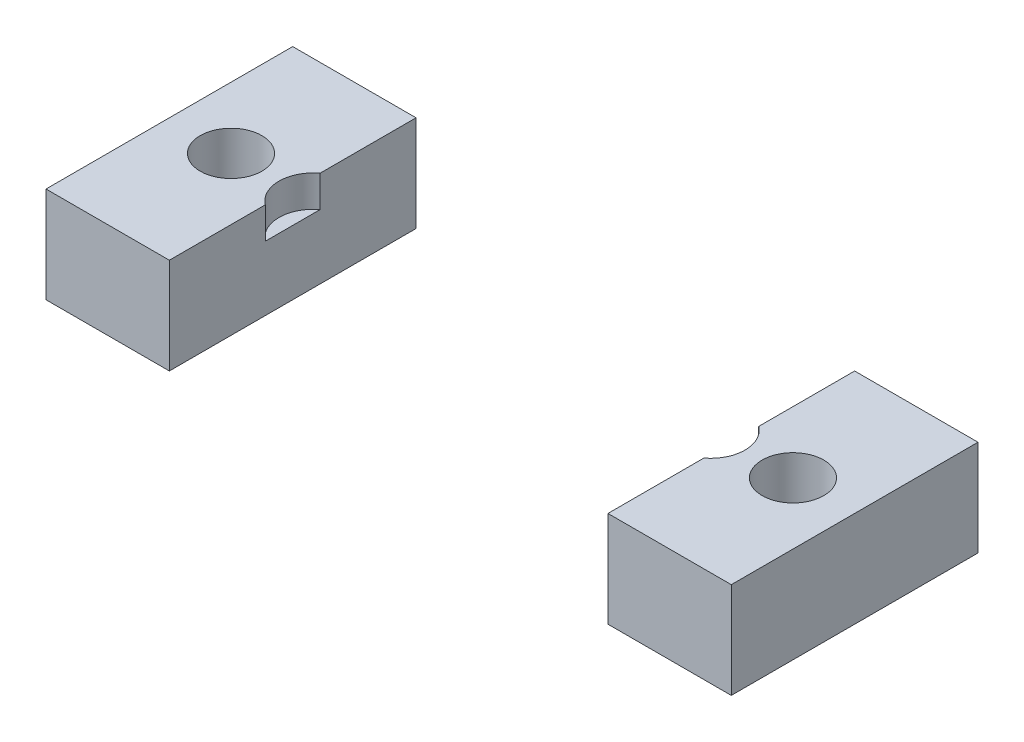
ISO-10303-21;
HEADER;
FILE_DESCRIPTION(('STEP AP214'),'2;1');
FILE_NAME('part.step','',(''),(''),'','','');
FILE_SCHEMA(('AUTOMOTIVE_DESIGN { 1 0 10303 214 1 1 1 1 }'));
ENDSEC;
DATA;
#1=APPLICATION_CONTEXT('core data for automotive mechanical design processes');
#2=APPLICATION_PROTOCOL_DEFINITION('international standard','automotive_design',2000,#1);
#3=PRODUCT_CONTEXT('',#1,'mechanical');
#4=PRODUCT('Part','Part','',(#3));
#5=PRODUCT_RELATED_PRODUCT_CATEGORY('part','',(#4));
#6=PRODUCT_DEFINITION_FORMATION('','',#4);
#7=PRODUCT_DEFINITION_CONTEXT('part definition',#1,'design');
#8=PRODUCT_DEFINITION('design','',#6,#7);
#9=PRODUCT_DEFINITION_SHAPE('','',#8);
#10=(LENGTH_UNIT() NAMED_UNIT(*) SI_UNIT(.MILLI.,.METRE.));
#11=(NAMED_UNIT(*) PLANE_ANGLE_UNIT() SI_UNIT($,.RADIAN.));
#12=(NAMED_UNIT(*) SI_UNIT($,.STERADIAN.) SOLID_ANGLE_UNIT());
#13=UNCERTAINTY_MEASURE_WITH_UNIT(LENGTH_MEASURE(1.E-05),#10,'distance_accuracy_value','');
#14=(GEOMETRIC_REPRESENTATION_CONTEXT(3) GLOBAL_UNCERTAINTY_ASSIGNED_CONTEXT((#13)) GLOBAL_UNIT_ASSIGNED_CONTEXT((#10,
#11,#12)) REPRESENTATION_CONTEXT('',''));
#15=CARTESIAN_POINT('',(0.,0.,0.));
#16=DIRECTION('',(0.,0.,1.));
#17=DIRECTION('',(1.,0.,0.));
#18=AXIS2_PLACEMENT_3D('',#15,#16,#17);
#19=CARTESIAN_POINT('',(0.,22.,0.));
#20=DIRECTION('',(0.,0.,-1.));
#21=DIRECTION('',(-1.,0.,0.));
#22=AXIS2_PLACEMENT_3D('',#19,#20,#21);
#23=PLANE('',#22);
#24=DIRECTION('',(0.,-1.,0.));
#25=VECTOR('',#24,1.);
#26=CARTESIAN_POINT('',(50.,22.,0.));
#27=LINE('',#26,#25);
#28=CARTESIAN_POINT('',(50.,7.,0.));
#29=VERTEX_POINT('',#28);
#30=CARTESIAN_POINT('',(50.,0.,0.));
#31=VERTEX_POINT('',#30);
#32=EDGE_CURVE('E90',#29,#31,#27,.T.);
#33=ORIENTED_EDGE('',*,*,#32,.F.);
#34=DIRECTION('',(1.,0.,0.));
#35=VECTOR('',#34,1.);
#36=CARTESIAN_POINT('',(9.,7.,0.));
#37=LINE('',#36,#35);
#38=CARTESIAN_POINT('',(41.,7.,0.));
#39=VERTEX_POINT('',#38);
#40=EDGE_CURVE('E85',#39,#29,#37,.T.);
#41=ORIENTED_EDGE('',*,*,#40,.F.);
#42=DIRECTION('',(0.,1.,0.));
#43=VECTOR('',#42,1.);
#44=CARTESIAN_POINT('',(41.,-7.,0.));
#45=LINE('',#44,#43);
#46=CARTESIAN_POINT('',(41.,0.,0.));
#47=VERTEX_POINT('',#46);
#48=EDGE_CURVE('E117',#47,#39,#45,.T.);
#49=ORIENTED_EDGE('',*,*,#48,.F.);
#50=DIRECTION('',(1.,0.,0.));
#51=VECTOR('',#50,1.);
#52=CARTESIAN_POINT('',(0.,0.,0.));
#53=LINE('',#52,#51);
#54=EDGE_CURVE('E124',#47,#31,#53,.T.);
#55=ORIENTED_EDGE('',*,*,#54,.T.);
#56=EDGE_LOOP('',(#33,#41,#49,#55));
#57=FACE_BOUND('',#56,.T.);
#58=ADVANCED_FACE('F46',(#57),#23,.F.);
#59=CARTESIAN_POINT('',(0.,0.,0.));
#60=DIRECTION('',(0.,-1.,0.));
#61=DIRECTION('',(0.,0.,-1.));
#62=AXIS2_PLACEMENT_3D('',#59,#60,#61);
#63=PLANE('',#62);
#64=CARTESIAN_POINT('',(45.5,0.,-9.));
#65=DIRECTION('',(0.,1.,0.));
#66=DIRECTION('',(0.,0.,-1.));
#67=AXIS2_PLACEMENT_3D('',#64,#65,#66);
#68=CIRCLE('',#67,2.25);
#69=CARTESIAN_POINT('',(45.5,0.,-11.25));
#70=VERTEX_POINT('',#69);
#71=EDGE_CURVE('E91',#70,#70,#68,.T.);
#72=ORIENTED_EDGE('',*,*,#71,.T.);
#73=EDGE_LOOP('',(#72));
#74=FACE_BOUND('',#73,.T.);
#75=DIRECTION('',(0.,0.,1.));
#76=VECTOR('',#75,1.);
#77=CARTESIAN_POINT('',(41.,0.,0.));
#78=LINE('',#77,#76);
#79=CARTESIAN_POINT('',(41.,0.,-18.));
#80=VERTEX_POINT('',#79);
#81=EDGE_CURVE('E110',#80,#47,#78,.T.);
#82=ORIENTED_EDGE('',*,*,#81,.F.);
#83=DIRECTION('',(-1.,0.,0.));
#84=VECTOR('',#83,1.);
#85=CARTESIAN_POINT('',(0.,0.,-18.));
#86=LINE('',#85,#84);
#87=CARTESIAN_POINT('',(50.,0.,-18.));
#88=VERTEX_POINT('',#87);
#89=EDGE_CURVE('E108',#88,#80,#86,.T.);
#90=ORIENTED_EDGE('',*,*,#89,.F.);
#91=DIRECTION('',(0.,0.,-1.));
#92=VECTOR('',#91,1.);
#93=CARTESIAN_POINT('',(50.,0.,0.));
#94=LINE('',#93,#92);
#95=EDGE_CURVE('E106',#31,#88,#94,.T.);
#96=ORIENTED_EDGE('',*,*,#95,.F.);
#97=ORIENTED_EDGE('',*,*,#54,.F.);
#98=EDGE_LOOP('',(#82,#90,#96,#97));
#99=FACE_BOUND('',#98,.T.);
#100=ADVANCED_FACE('F147',(#74,#99),#63,.T.);
#101=CARTESIAN_POINT('',(50.,22.,0.));
#102=DIRECTION('',(-1.,0.,0.));
#103=DIRECTION('',(0.,0.,1.));
#104=AXIS2_PLACEMENT_3D('',#101,#102,#103);
#105=PLANE('',#104);
#106=DIRECTION('',(0.,-1.,0.));
#107=VECTOR('',#106,1.);
#108=CARTESIAN_POINT('',(50.,22.,-18.));
#109=LINE('',#108,#107);
#110=CARTESIAN_POINT('',(50.,7.,-18.));
#111=VERTEX_POINT('',#110);
#112=EDGE_CURVE('E99',#111,#88,#109,.T.);
#113=ORIENTED_EDGE('',*,*,#112,.F.);
#114=DIRECTION('',(0.,0.,1.));
#115=VECTOR('',#114,1.);
#116=CARTESIAN_POINT('',(50.,7.,-18.));
#117=LINE('',#116,#115);
#118=EDGE_CURVE('E80',#111,#29,#117,.T.);
#119=ORIENTED_EDGE('',*,*,#118,.T.);
#120=ORIENTED_EDGE('',*,*,#32,.T.);
#121=ORIENTED_EDGE('',*,*,#95,.T.);
#122=EDGE_LOOP('',(#113,#119,#120,#121));
#123=FACE_BOUND('',#122,.T.);
#124=ADVANCED_FACE('F104',(#123),#105,.F.);
#125=CARTESIAN_POINT('',(0.,22.,-18.));
#126=DIRECTION('',(0.,0.,1.));
#127=DIRECTION('',(1.,0.,0.));
#128=AXIS2_PLACEMENT_3D('',#125,#126,#127);
#129=PLANE('',#128);
#130=DIRECTION('',(0.,1.,0.));
#131=VECTOR('',#130,1.);
#132=CARTESIAN_POINT('',(41.,-7.,-18.));
#133=LINE('',#132,#131);
#134=CARTESIAN_POINT('',(41.,7.,-18.));
#135=VERTEX_POINT('',#134);
#136=EDGE_CURVE('E102',#80,#135,#133,.T.);
#137=ORIENTED_EDGE('',*,*,#136,.T.);
#138=DIRECTION('',(1.,0.,0.));
#139=VECTOR('',#138,1.);
#140=CARTESIAN_POINT('',(0.,7.,-18.));
#141=LINE('',#140,#139);
#142=EDGE_CURVE('E83',#135,#111,#141,.T.);
#143=ORIENTED_EDGE('',*,*,#142,.T.);
#144=ORIENTED_EDGE('',*,*,#112,.T.);
#145=ORIENTED_EDGE('',*,*,#89,.T.);
#146=EDGE_LOOP('',(#137,#143,#144,#145));
#147=FACE_BOUND('',#146,.T.);
#148=ADVANCED_FACE('F96',(#147),#129,.F.);
#149=CARTESIAN_POINT('',(41.,-7.,-18.));
#150=DIRECTION('',(1.,0.,0.));
#151=DIRECTION('',(0.,0.,-1.));
#152=AXIS2_PLACEMENT_3D('',#149,#150,#151);
#153=PLANE('',#152);
#154=DIRECTION('',(0.,0.,1.));
#155=VECTOR('',#154,1.);
#156=CARTESIAN_POINT('',(41.,4.7,-18.));
#157=LINE('',#156,#155);
#158=CARTESIAN_POINT('',(41.,4.7,-11.));
#159=VERTEX_POINT('',#158);
#160=CARTESIAN_POINT('',(41.,4.7,-7.));
#161=VERTEX_POINT('',#160);
#162=EDGE_CURVE('E12',#159,#161,#157,.T.);
#163=ORIENTED_EDGE('',*,*,#162,.F.);
#164=DIRECTION('',(0.,1.,0.));
#165=VECTOR('',#164,1.);
#166=CARTESIAN_POINT('',(41.,4.7,-11.));
#167=LINE('',#166,#165);
#168=CARTESIAN_POINT('',(41.,7.,-11.));
#169=VERTEX_POINT('',#168);
#170=EDGE_CURVE('E128',#159,#169,#167,.T.);
#171=ORIENTED_EDGE('',*,*,#170,.T.);
#172=DIRECTION('',(0.,0.,1.));
#173=VECTOR('',#172,1.);
#174=CARTESIAN_POINT('',(41.,7.,-18.));
#175=LINE('',#174,#173);
#176=EDGE_CURVE('E54',#135,#169,#175,.T.);
#177=ORIENTED_EDGE('',*,*,#176,.F.);
#178=ORIENTED_EDGE('',*,*,#136,.F.);
#179=ORIENTED_EDGE('',*,*,#81,.T.);
#180=ORIENTED_EDGE('',*,*,#48,.T.);
#181=CARTESIAN_POINT('',(41.,7.,-7.));
#182=VERTEX_POINT('',#181);
#183=EDGE_CURVE('E69',#182,#39,#175,.T.);
#184=ORIENTED_EDGE('',*,*,#183,.F.);
#185=DIRECTION('',(0.,1.,0.));
#186=VECTOR('',#185,1.);
#187=CARTESIAN_POINT('',(41.,4.7,-7.));
#188=LINE('',#187,#186);
#189=EDGE_CURVE('E61',#182,#161,#188,.F.);
#190=ORIENTED_EDGE('',*,*,#189,.T.);
#191=EDGE_LOOP('',(#163,#171,#177,#178,#179,#180,#184,#190));
#192=FACE_BOUND('',#191,.T.);
#193=ADVANCED_FACE('F145',(#192),#153,.F.);
#194=CARTESIAN_POINT('',(45.5,0.,-9.));
#195=DIRECTION('',(0.,1.,0.));
#196=DIRECTION('',(0.,0.,1.));
#197=AXIS2_PLACEMENT_3D('',#194,#195,#196);
#198=CYLINDRICAL_SURFACE('',#197,2.25);
#199=CARTESIAN_POINT('',(45.5,7.,-9.));
#200=DIRECTION('',(0.,-1.,0.));
#201=DIRECTION('',(0.,0.,-1.));
#202=AXIS2_PLACEMENT_3D('',#199,#200,#201);
#203=CIRCLE('',#202,2.25);
#204=CARTESIAN_POINT('',(45.5,7.,-11.25));
#205=VERTEX_POINT('',#204);
#206=EDGE_CURVE('E120',#205,#205,#203,.F.);
#207=ORIENTED_EDGE('',*,*,#206,.T.);
#208=EDGE_LOOP('',(#207));
#209=FACE_BOUND('',#208,.T.);
#210=ORIENTED_EDGE('',*,*,#71,.F.);
#211=EDGE_LOOP('',(#210));
#212=FACE_BOUND('',#211,.T.);
#213=ADVANCED_FACE('F177',(#209,#212),#198,.F.);
#214=CARTESIAN_POINT('',(9.,7.,-18.));
#215=DIRECTION('',(0.,-1.,0.));
#216=DIRECTION('',(0.,0.,-1.));
#217=AXIS2_PLACEMENT_3D('',#214,#215,#216);
#218=PLANE('',#217);
#219=ORIENTED_EDGE('',*,*,#206,.F.);
#220=EDGE_LOOP('',(#219));
#221=FACE_BOUND('',#220,.T.);
#222=ORIENTED_EDGE('',*,*,#176,.T.);
#223=CARTESIAN_POINT('',(39.5,7.,-9.));
#224=DIRECTION('',(0.,1.,0.));
#225=DIRECTION('',(0.,0.,1.));
#226=AXIS2_PLACEMENT_3D('',#223,#224,#225);
#227=CIRCLE('',#226,2.5);
#228=EDGE_CURVE('E160',#182,#169,#227,.T.);
#229=ORIENTED_EDGE('',*,*,#228,.F.);
#230=ORIENTED_EDGE('',*,*,#183,.T.);
#231=ORIENTED_EDGE('',*,*,#40,.T.);
#232=ORIENTED_EDGE('',*,*,#118,.F.);
#233=ORIENTED_EDGE('',*,*,#142,.F.);
#234=EDGE_LOOP('',(#222,#229,#230,#231,#232,#233));
#235=FACE_BOUND('',#234,.T.);
#236=ADVANCED_FACE('F48',(#221,#235),#218,.F.);
#237=CARTESIAN_POINT('',(39.5,4.7,-9.));
#238=DIRECTION('',(0.,1.,0.));
#239=DIRECTION('',(0.,0.,1.));
#240=AXIS2_PLACEMENT_3D('',#237,#238,#239);
#241=PLANE('',#240);
#242=ORIENTED_EDGE('',*,*,#162,.T.);
#243=CARTESIAN_POINT('',(39.5,4.7,-9.));
#244=DIRECTION('',(0.,1.,0.));
#245=DIRECTION('',(0.,0.,1.));
#246=AXIS2_PLACEMENT_3D('',#243,#244,#245);
#247=CIRCLE('',#246,2.5);
#248=EDGE_CURVE('E139',#161,#159,#247,.T.);
#249=ORIENTED_EDGE('',*,*,#248,.T.);
#250=EDGE_LOOP('',(#242,#249));
#251=FACE_BOUND('',#250,.T.);
#252=ADVANCED_FACE('F158',(#251),#241,.T.);
#253=CARTESIAN_POINT('',(39.5,4.7,-9.));
#254=DIRECTION('',(0.,1.,0.));
#255=DIRECTION('',(0.,0.,1.));
#256=AXIS2_PLACEMENT_3D('',#253,#254,#255);
#257=CYLINDRICAL_SURFACE('',#256,2.5);
#258=ORIENTED_EDGE('',*,*,#248,.F.);
#259=ORIENTED_EDGE('',*,*,#189,.F.);
#260=ORIENTED_EDGE('',*,*,#228,.T.);
#261=ORIENTED_EDGE('',*,*,#170,.F.);
#262=EDGE_LOOP('',(#258,#259,#260,#261));
#263=FACE_BOUND('',#262,.T.);
#264=ADVANCED_FACE('F159',(#263),#257,.F.);
#265=CLOSED_SHELL('',(#58,#100,#124,#148,#193,#213,#236,#252,#264));
#266=MANIFOLD_SOLID_BREP('B2',#265);
#267=CARTESIAN_POINT('',(9.,-7.,-18.));
#268=DIRECTION('',(-1.,0.,0.));
#269=DIRECTION('',(0.,0.,1.));
#270=AXIS2_PLACEMENT_3D('',#267,#268,#269);
#271=PLANE('',#270);
#272=DIRECTION('',(0.,0.,1.));
#273=VECTOR('',#272,1.);
#274=CARTESIAN_POINT('',(9.,4.7,-18.));
#275=LINE('',#274,#273);
#276=CARTESIAN_POINT('',(9.,4.7,-11.));
#277=VERTEX_POINT('',#276);
#278=CARTESIAN_POINT('',(9.,4.7,-7.00000000000001));
#279=VERTEX_POINT('',#278);
#280=EDGE_CURVE('E44',#277,#279,#275,.T.);
#281=ORIENTED_EDGE('',*,*,#280,.T.);
#282=DIRECTION('',(0.,1.,0.));
#283=VECTOR('',#282,1.);
#284=CARTESIAN_POINT('',(9.,4.7,-7.00000000000001));
#285=LINE('',#284,#283);
#286=CARTESIAN_POINT('',(9.,7.,-7.00000000000001));
#287=VERTEX_POINT('',#286);
#288=EDGE_CURVE('E302',#279,#287,#285,.T.);
#289=ORIENTED_EDGE('',*,*,#288,.T.);
#290=DIRECTION('',(0.,0.,1.));
#291=VECTOR('',#290,1.);
#292=CARTESIAN_POINT('',(9.,7.,-18.));
#293=LINE('',#292,#291);
#294=CARTESIAN_POINT('',(9.,7.,0.));
#295=VERTEX_POINT('',#294);
#296=EDGE_CURVE('E327',#287,#295,#293,.T.);
#297=ORIENTED_EDGE('',*,*,#296,.T.);
#298=DIRECTION('',(0.,-1.,0.));
#299=VECTOR('',#298,1.);
#300=CARTESIAN_POINT('',(9.,-7.,0.));
#301=LINE('',#300,#299);
#302=CARTESIAN_POINT('',(9.,0.,0.));
#303=VERTEX_POINT('',#302);
#304=EDGE_CURVE('E268',#295,#303,#301,.T.);
#305=ORIENTED_EDGE('',*,*,#304,.T.);
#306=DIRECTION('',(0.,0.,-1.));
#307=VECTOR('',#306,1.);
#308=CARTESIAN_POINT('',(9.,0.,0.));
#309=LINE('',#308,#307);
#310=CARTESIAN_POINT('',(9.,0.,-18.));
#311=VERTEX_POINT('',#310);
#312=EDGE_CURVE('E253',#303,#311,#309,.T.);
#313=ORIENTED_EDGE('',*,*,#312,.T.);
#314=DIRECTION('',(0.,-1.,0.));
#315=VECTOR('',#314,1.);
#316=CARTESIAN_POINT('',(9.,-7.,-18.));
#317=LINE('',#316,#315);
#318=CARTESIAN_POINT('',(9.,7.,-18.));
#319=VERTEX_POINT('',#318);
#320=EDGE_CURVE('E324',#319,#311,#317,.T.);
#321=ORIENTED_EDGE('',*,*,#320,.F.);
#322=CARTESIAN_POINT('',(9.,7.,-11.));
#323=VERTEX_POINT('',#322);
#324=EDGE_CURVE('E307',#319,#323,#293,.T.);
#325=ORIENTED_EDGE('',*,*,#324,.T.);
#326=DIRECTION('',(0.,1.,0.));
#327=VECTOR('',#326,1.);
#328=CARTESIAN_POINT('',(9.,4.7,-11.));
#329=LINE('',#328,#327);
#330=EDGE_CURVE('E260',#323,#277,#329,.F.);
#331=ORIENTED_EDGE('',*,*,#330,.T.);
#332=EDGE_LOOP('',(#281,#289,#297,#305,#313,#321,#325,#331));
#333=FACE_BOUND('',#332,.T.);
#334=ADVANCED_FACE('F245',(#333),#271,.F.);
#335=CARTESIAN_POINT('',(0.,22.,0.));
#336=DIRECTION('',(0.,0.,-1.));
#337=DIRECTION('',(-1.,0.,0.));
#338=AXIS2_PLACEMENT_3D('',#335,#336,#337);
#339=PLANE('',#338);
#340=ORIENTED_EDGE('',*,*,#304,.F.);
#341=DIRECTION('',(1.,0.,0.));
#342=VECTOR('',#341,1.);
#343=CARTESIAN_POINT('',(9.,7.,0.));
#344=LINE('',#343,#342);
#345=CARTESIAN_POINT('',(0.,7.,0.));
#346=VERTEX_POINT('',#345);
#347=EDGE_CURVE('E309',#346,#295,#344,.T.);
#348=ORIENTED_EDGE('',*,*,#347,.F.);
#349=DIRECTION('',(0.,-1.,0.));
#350=VECTOR('',#349,1.);
#351=CARTESIAN_POINT('',(0.,22.,0.));
#352=LINE('',#351,#350);
#353=CARTESIAN_POINT('',(0.,0.,0.));
#354=VERTEX_POINT('',#353);
#355=EDGE_CURVE('E341',#346,#354,#352,.T.);
#356=ORIENTED_EDGE('',*,*,#355,.T.);
#357=DIRECTION('',(1.,0.,0.));
#358=VECTOR('',#357,1.);
#359=CARTESIAN_POINT('',(0.,0.,0.));
#360=LINE('',#359,#358);
#361=EDGE_CURVE('E333',#354,#303,#360,.T.);
#362=ORIENTED_EDGE('',*,*,#361,.T.);
#363=EDGE_LOOP('',(#340,#348,#356,#362));
#364=FACE_BOUND('',#363,.T.);
#365=ADVANCED_FACE('F358',(#364),#339,.F.);
#366=CARTESIAN_POINT('',(0.,22.,0.));
#367=DIRECTION('',(1.,0.,0.));
#368=DIRECTION('',(0.,0.,-1.));
#369=AXIS2_PLACEMENT_3D('',#366,#367,#368);
#370=PLANE('',#369);
#371=ORIENTED_EDGE('',*,*,#355,.F.);
#372=DIRECTION('',(0.,0.,1.));
#373=VECTOR('',#372,1.);
#374=CARTESIAN_POINT('',(0.,7.,-18.));
#375=LINE('',#374,#373);
#376=CARTESIAN_POINT('',(0.,7.,-18.));
#377=VERTEX_POINT('',#376);
#378=EDGE_CURVE('E316',#377,#346,#375,.T.);
#379=ORIENTED_EDGE('',*,*,#378,.F.);
#380=DIRECTION('',(0.,-1.,0.));
#381=VECTOR('',#380,1.);
#382=CARTESIAN_POINT('',(0.,22.,-18.));
#383=LINE('',#382,#381);
#384=CARTESIAN_POINT('',(0.,0.,-18.));
#385=VERTEX_POINT('',#384);
#386=EDGE_CURVE('E339',#377,#385,#383,.T.);
#387=ORIENTED_EDGE('',*,*,#386,.T.);
#388=DIRECTION('',(0.,0.,1.));
#389=VECTOR('',#388,1.);
#390=CARTESIAN_POINT('',(0.,0.,0.));
#391=LINE('',#390,#389);
#392=EDGE_CURVE('E330',#385,#354,#391,.T.);
#393=ORIENTED_EDGE('',*,*,#392,.T.);
#394=EDGE_LOOP('',(#371,#379,#387,#393));
#395=FACE_BOUND('',#394,.T.);
#396=ADVANCED_FACE('F247',(#395),#370,.F.);
#397=CARTESIAN_POINT('',(0.,22.,-18.));
#398=DIRECTION('',(0.,0.,1.));
#399=DIRECTION('',(1.,0.,0.));
#400=AXIS2_PLACEMENT_3D('',#397,#398,#399);
#401=PLANE('',#400);
#402=ORIENTED_EDGE('',*,*,#386,.F.);
#403=DIRECTION('',(1.,0.,0.));
#404=VECTOR('',#403,1.);
#405=CARTESIAN_POINT('',(0.,7.,-18.));
#406=LINE('',#405,#404);
#407=EDGE_CURVE('E313',#377,#319,#406,.T.);
#408=ORIENTED_EDGE('',*,*,#407,.T.);
#409=ORIENTED_EDGE('',*,*,#320,.T.);
#410=DIRECTION('',(-1.,0.,0.));
#411=VECTOR('',#410,1.);
#412=CARTESIAN_POINT('',(0.,0.,-18.));
#413=LINE('',#412,#411);
#414=EDGE_CURVE('E336',#311,#385,#413,.T.);
#415=ORIENTED_EDGE('',*,*,#414,.T.);
#416=EDGE_LOOP('',(#402,#408,#409,#415));
#417=FACE_BOUND('',#416,.T.);
#418=ADVANCED_FACE('F367',(#417),#401,.F.);
#419=CARTESIAN_POINT('',(0.,0.,0.));
#420=DIRECTION('',(0.,-1.,0.));
#421=DIRECTION('',(0.,0.,-1.));
#422=AXIS2_PLACEMENT_3D('',#419,#420,#421);
#423=PLANE('',#422);
#424=CARTESIAN_POINT('',(4.5,0.,-9.));
#425=DIRECTION('',(0.,1.,0.));
#426=DIRECTION('',(0.,0.,1.));
#427=AXIS2_PLACEMENT_3D('',#424,#425,#426);
#428=CIRCLE('',#427,2.25);
#429=CARTESIAN_POINT('',(4.5,0.,-6.75));
#430=VERTEX_POINT('',#429);
#431=EDGE_CURVE('E321',#430,#430,#428,.T.);
#432=ORIENTED_EDGE('',*,*,#431,.T.);
#433=EDGE_LOOP('',(#432));
#434=FACE_BOUND('',#433,.T.);
#435=ORIENTED_EDGE('',*,*,#312,.F.);
#436=ORIENTED_EDGE('',*,*,#361,.F.);
#437=ORIENTED_EDGE('',*,*,#392,.F.);
#438=ORIENTED_EDGE('',*,*,#414,.F.);
#439=EDGE_LOOP('',(#435,#436,#437,#438));
#440=FACE_BOUND('',#439,.T.);
#441=ADVANCED_FACE('F362',(#434,#440),#423,.T.);
#442=CARTESIAN_POINT('',(4.5,0.,-9.));
#443=DIRECTION('',(0.,1.,0.));
#444=DIRECTION('',(0.,0.,1.));
#445=AXIS2_PLACEMENT_3D('',#442,#443,#444);
#446=CYLINDRICAL_SURFACE('',#445,2.25);
#447=CARTESIAN_POINT('',(4.5,7.,-9.));
#448=DIRECTION('',(0.,-1.,0.));
#449=DIRECTION('',(0.,0.,-1.));
#450=AXIS2_PLACEMENT_3D('',#447,#448,#449);
#451=CIRCLE('',#450,2.25);
#452=CARTESIAN_POINT('',(4.5,7.,-11.25));
#453=VERTEX_POINT('',#452);
#454=EDGE_CURVE('E320',#453,#453,#451,.F.);
#455=ORIENTED_EDGE('',*,*,#454,.T.);
#456=EDGE_LOOP('',(#455));
#457=FACE_BOUND('',#456,.T.);
#458=ORIENTED_EDGE('',*,*,#431,.F.);
#459=EDGE_LOOP('',(#458));
#460=FACE_BOUND('',#459,.T.);
#461=ADVANCED_FACE('F346',(#457,#460),#446,.F.);
#462=CARTESIAN_POINT('',(9.,7.,-18.));
#463=DIRECTION('',(0.,-1.,0.));
#464=DIRECTION('',(0.,0.,-1.));
#465=AXIS2_PLACEMENT_3D('',#462,#463,#464);
#466=PLANE('',#465);
#467=ORIENTED_EDGE('',*,*,#454,.F.);
#468=EDGE_LOOP('',(#467));
#469=FACE_BOUND('',#468,.T.);
#470=ORIENTED_EDGE('',*,*,#296,.F.);
#471=CARTESIAN_POINT('',(10.5,7.,-9.));
#472=DIRECTION('',(0.,1.,0.));
#473=DIRECTION('',(0.,0.,-1.));
#474=AXIS2_PLACEMENT_3D('',#471,#472,#473);
#475=CIRCLE('',#474,2.5);
#476=EDGE_CURVE('E303',#323,#287,#475,.T.);
#477=ORIENTED_EDGE('',*,*,#476,.F.);
#478=ORIENTED_EDGE('',*,*,#324,.F.);
#479=ORIENTED_EDGE('',*,*,#407,.F.);
#480=ORIENTED_EDGE('',*,*,#378,.T.);
#481=ORIENTED_EDGE('',*,*,#347,.T.);
#482=EDGE_LOOP('',(#470,#477,#478,#479,#480,#481));
#483=FACE_BOUND('',#482,.T.);
#484=ADVANCED_FACE('F349',(#469,#483),#466,.F.);
#485=CARTESIAN_POINT('',(10.5,4.7,-9.));
#486=DIRECTION('',(0.,-1.,0.));
#487=DIRECTION('',(0.,0.,-1.));
#488=AXIS2_PLACEMENT_3D('',#485,#486,#487);
#489=PLANE('',#488);
#490=CARTESIAN_POINT('',(10.5,4.7,-9.));
#491=DIRECTION('',(0.,1.,0.));
#492=DIRECTION('',(0.,0.,-1.));
#493=AXIS2_PLACEMENT_3D('',#490,#491,#492);
#494=CIRCLE('',#493,2.5);
#495=EDGE_CURVE('E299',#277,#279,#494,.T.);
#496=ORIENTED_EDGE('',*,*,#495,.T.);
#497=ORIENTED_EDGE('',*,*,#280,.F.);
#498=EDGE_LOOP('',(#496,#497));
#499=FACE_BOUND('',#498,.T.);
#500=ADVANCED_FACE('F298',(#499),#489,.F.);
#501=CARTESIAN_POINT('',(10.5,4.7,-9.));
#502=DIRECTION('',(0.,1.,0.));
#503=DIRECTION('',(0.,0.,1.));
#504=AXIS2_PLACEMENT_3D('',#501,#502,#503);
#505=CYLINDRICAL_SURFACE('',#504,2.5);
#506=ORIENTED_EDGE('',*,*,#495,.F.);
#507=ORIENTED_EDGE('',*,*,#330,.F.);
#508=ORIENTED_EDGE('',*,*,#476,.T.);
#509=ORIENTED_EDGE('',*,*,#288,.F.);
#510=EDGE_LOOP('',(#506,#507,#508,#509));
#511=FACE_BOUND('',#510,.T.);
#512=ADVANCED_FACE('F301',(#511),#505,.F.);
#513=CLOSED_SHELL('',(#334,#365,#396,#418,#441,#461,#484,#500,#512));
#514=MANIFOLD_SOLID_BREP('B6',#513);
#515=ADVANCED_BREP_SHAPE_REPRESENTATION('',(#18,#266,#514),#14);
#516=SHAPE_DEFINITION_REPRESENTATION(#9,#515);
ENDSEC;
END-ISO-10303-21;
